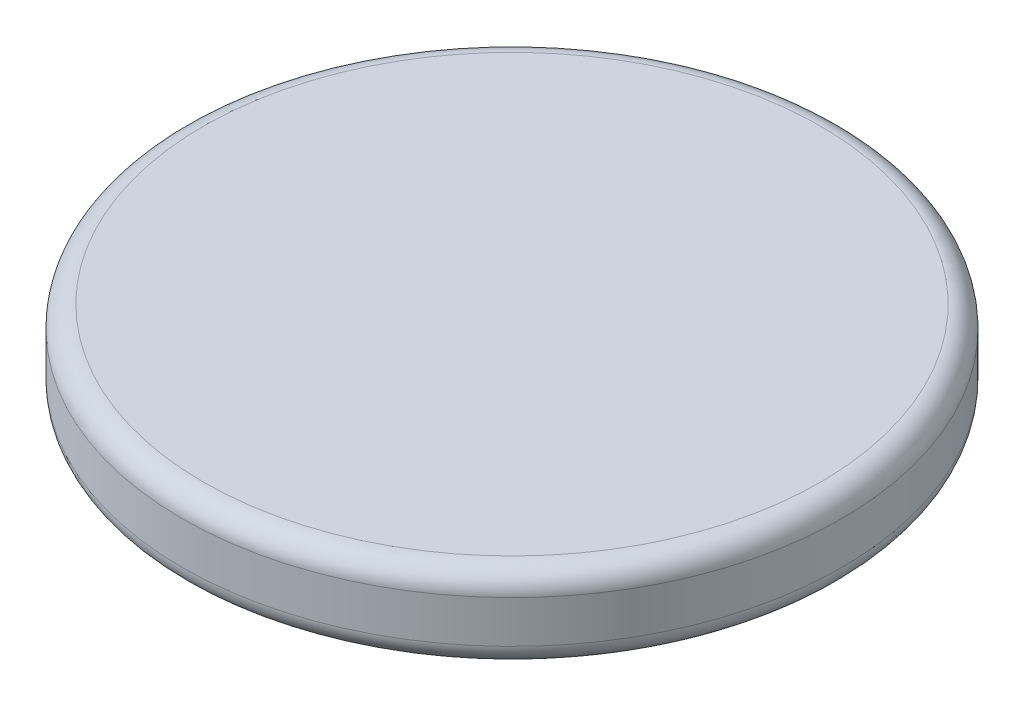
ISO-10303-21;
HEADER;
FILE_DESCRIPTION(('STEP AP214'),'2;1');
FILE_NAME('part.step','',(''),(''),'','','');
FILE_SCHEMA(('AUTOMOTIVE_DESIGN { 1 0 10303 214 1 1 1 1 }'));
ENDSEC;
DATA;
#1=APPLICATION_CONTEXT('core data for automotive mechanical design processes');
#2=APPLICATION_PROTOCOL_DEFINITION('international standard','automotive_design',2000,#1);
#3=PRODUCT_CONTEXT('',#1,'mechanical');
#4=PRODUCT('Part','Part','',(#3));
#5=PRODUCT_RELATED_PRODUCT_CATEGORY('part','',(#4));
#6=PRODUCT_DEFINITION_FORMATION('','',#4);
#7=PRODUCT_DEFINITION_CONTEXT('part definition',#1,'design');
#8=PRODUCT_DEFINITION('design','',#6,#7);
#9=PRODUCT_DEFINITION_SHAPE('','',#8);
#10=(LENGTH_UNIT() NAMED_UNIT(*) SI_UNIT(.MILLI.,.METRE.));
#11=(NAMED_UNIT(*) PLANE_ANGLE_UNIT() SI_UNIT($,.RADIAN.));
#12=(NAMED_UNIT(*) SI_UNIT($,.STERADIAN.) SOLID_ANGLE_UNIT());
#13=UNCERTAINTY_MEASURE_WITH_UNIT(LENGTH_MEASURE(1.E-05),#10,'distance_accuracy_value','');
#14=(GEOMETRIC_REPRESENTATION_CONTEXT(3) GLOBAL_UNCERTAINTY_ASSIGNED_CONTEXT((#13)) GLOBAL_UNIT_ASSIGNED_CONTEXT((#10,
#11,#12)) REPRESENTATION_CONTEXT('',''));
#15=CARTESIAN_POINT('',(0.,0.,0.));
#16=DIRECTION('',(0.,0.,1.));
#17=DIRECTION('',(1.,0.,0.));
#18=AXIS2_PLACEMENT_3D('',#15,#16,#17);
#19=CARTESIAN_POINT('',(0.,12.7,0.));
#20=DIRECTION('',(0.,-1.,0.));
#21=DIRECTION('',(0.,0.,-1.));
#22=AXIS2_PLACEMENT_3D('',#19,#20,#21);
#23=CYLINDRICAL_SURFACE('',#22,49.53);
#24=CARTESIAN_POINT('',(0.,3.175,0.));
#25=DIRECTION('',(0.,1.,0.));
#26=DIRECTION('',(0.,0.,1.));
#27=AXIS2_PLACEMENT_3D('',#24,#25,#26);
#28=CIRCLE('',#27,49.53);
#29=CARTESIAN_POINT('',(0.,3.175,49.53));
#30=VERTEX_POINT('',#29);
#31=EDGE_CURVE('E48',#30,#30,#28,.T.);
#32=ORIENTED_EDGE('',*,*,#31,.T.);
#33=EDGE_LOOP('',(#32));
#34=FACE_BOUND('',#33,.T.);
#35=CARTESIAN_POINT('',(0.,9.525,0.));
#36=DIRECTION('',(0.,1.,0.));
#37=DIRECTION('',(0.,0.,1.));
#38=AXIS2_PLACEMENT_3D('',#35,#36,#37);
#39=CIRCLE('',#38,49.53);
#40=CARTESIAN_POINT('',(0.,9.525,49.53));
#41=VERTEX_POINT('',#40);
#42=EDGE_CURVE('E52',#41,#41,#39,.F.);
#43=ORIENTED_EDGE('',*,*,#42,.T.);
#44=EDGE_LOOP('',(#43));
#45=FACE_BOUND('',#44,.T.);
#46=ADVANCED_FACE('F37',(#34,#45),#23,.T.);
#47=CARTESIAN_POINT('',(0.,12.7,0.));
#48=DIRECTION('',(0.,1.,0.));
#49=DIRECTION('',(0.,0.,1.));
#50=AXIS2_PLACEMENT_3D('',#47,#48,#49);
#51=PLANE('',#50);
#52=CARTESIAN_POINT('',(0.,12.7,0.));
#53=DIRECTION('',(0.,1.,0.));
#54=DIRECTION('',(0.,0.,1.));
#55=AXIS2_PLACEMENT_3D('',#52,#53,#54);
#56=CIRCLE('',#55,46.355);
#57=CARTESIAN_POINT('',(0.,12.7,46.355));
#58=VERTEX_POINT('',#57);
#59=EDGE_CURVE('E10',#58,#58,#56,.T.);
#60=ORIENTED_EDGE('',*,*,#59,.T.);
#61=EDGE_LOOP('',(#60));
#62=FACE_BOUND('',#61,.T.);
#63=ADVANCED_FACE('F68',(#62),#51,.T.);
#64=CARTESIAN_POINT('',(0.,0.,0.));
#65=DIRECTION('',(0.,1.,0.));
#66=DIRECTION('',(0.,0.,1.));
#67=AXIS2_PLACEMENT_3D('',#64,#65,#66);
#68=PLANE('',#67);
#69=CARTESIAN_POINT('',(0.,0.,0.));
#70=DIRECTION('',(0.,1.,0.));
#71=DIRECTION('',(0.,0.,1.));
#72=AXIS2_PLACEMENT_3D('',#69,#70,#71);
#73=CIRCLE('',#72,46.355);
#74=CARTESIAN_POINT('',(0.,0.,46.355));
#75=VERTEX_POINT('',#74);
#76=EDGE_CURVE('E44',#75,#75,#73,.F.);
#77=ORIENTED_EDGE('',*,*,#76,.T.);
#78=EDGE_LOOP('',(#77));
#79=FACE_BOUND('',#78,.T.);
#80=ADVANCED_FACE('F65',(#79),#68,.F.);
#81=CARTESIAN_POINT('',(0.,3.175,0.));
#82=DIRECTION('',(0.,1.,0.));
#83=DIRECTION('',(0.,0.,1.));
#84=AXIS2_PLACEMENT_3D('',#81,#82,#83);
#85=TOROIDAL_SURFACE('',#84,46.355,3.175);
#86=ORIENTED_EDGE('',*,*,#76,.F.);
#87=EDGE_LOOP('',(#86));
#88=FACE_BOUND('',#87,.T.);
#89=ORIENTED_EDGE('',*,*,#31,.F.);
#90=EDGE_LOOP('',(#89));
#91=FACE_BOUND('',#90,.T.);
#92=ADVANCED_FACE('F61',(#88,#91),#85,.T.);
#93=CARTESIAN_POINT('',(0.,9.525,0.));
#94=DIRECTION('',(0.,1.,0.));
#95=DIRECTION('',(0.,0.,1.));
#96=AXIS2_PLACEMENT_3D('',#93,#94,#95);
#97=TOROIDAL_SURFACE('',#96,46.355,3.175);
#98=ORIENTED_EDGE('',*,*,#42,.F.);
#99=EDGE_LOOP('',(#98));
#100=FACE_BOUND('',#99,.T.);
#101=ORIENTED_EDGE('',*,*,#59,.F.);
#102=EDGE_LOOP('',(#101));
#103=FACE_BOUND('',#102,.T.);
#104=ADVANCED_FACE('F39',(#100,#103),#97,.T.);
#105=CLOSED_SHELL('',(#46,#63,#80,#92,#104));
#106=MANIFOLD_SOLID_BREP('B2',#105);
#107=ADVANCED_BREP_SHAPE_REPRESENTATION('',(#18,#106),#14);
#108=SHAPE_DEFINITION_REPRESENTATION(#9,#107);
ENDSEC;
END-ISO-10303-21;
